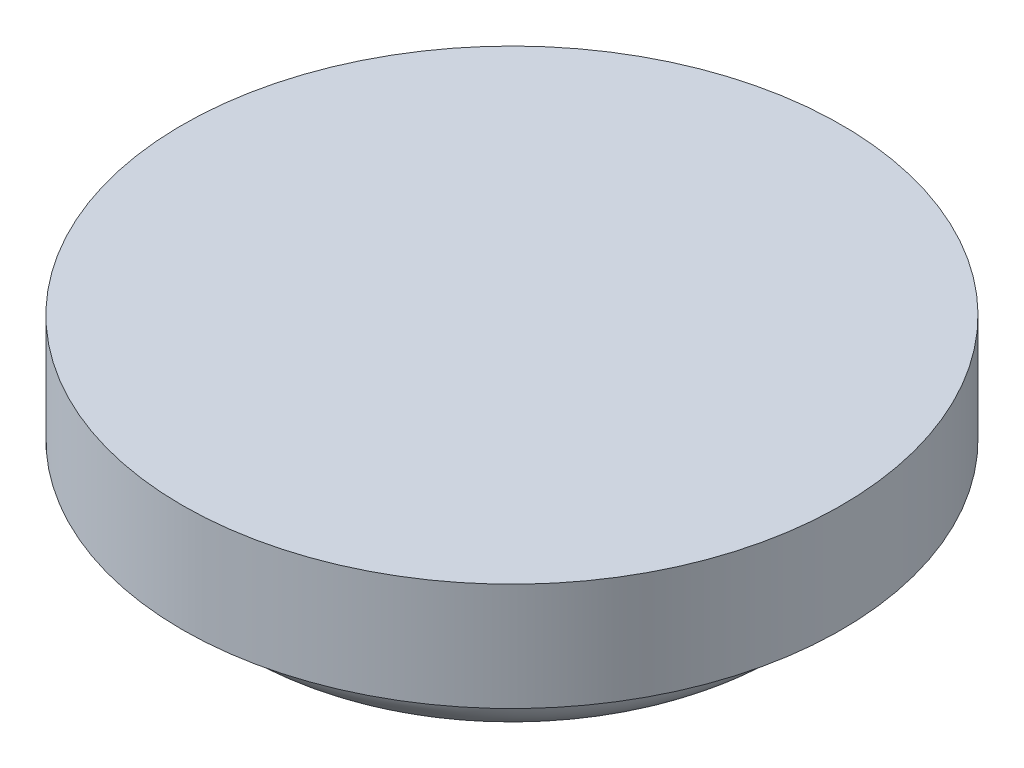
ISO-10303-21;
HEADER;
FILE_DESCRIPTION(('STEP AP214'),'2;1');
FILE_NAME('part.step','',(''),(''),'','','');
FILE_SCHEMA(('AUTOMOTIVE_DESIGN { 1 0 10303 214 1 1 1 1 }'));
ENDSEC;
DATA;
#1=APPLICATION_CONTEXT('core data for automotive mechanical design processes');
#2=APPLICATION_PROTOCOL_DEFINITION('international standard','automotive_design',2000,#1);
#3=PRODUCT_CONTEXT('',#1,'mechanical');
#4=PRODUCT('Part','Part','',(#3));
#5=PRODUCT_RELATED_PRODUCT_CATEGORY('part','',(#4));
#6=PRODUCT_DEFINITION_FORMATION('','',#4);
#7=PRODUCT_DEFINITION_CONTEXT('part definition',#1,'design');
#8=PRODUCT_DEFINITION('design','',#6,#7);
#9=PRODUCT_DEFINITION_SHAPE('','',#8);
#10=(LENGTH_UNIT() NAMED_UNIT(*) SI_UNIT(.MILLI.,.METRE.));
#11=(NAMED_UNIT(*) PLANE_ANGLE_UNIT() SI_UNIT($,.RADIAN.));
#12=(NAMED_UNIT(*) SI_UNIT($,.STERADIAN.) SOLID_ANGLE_UNIT());
#13=UNCERTAINTY_MEASURE_WITH_UNIT(LENGTH_MEASURE(1.E-05),#10,'distance_accuracy_value','');
#14=(GEOMETRIC_REPRESENTATION_CONTEXT(3) GLOBAL_UNCERTAINTY_ASSIGNED_CONTEXT((#13)) GLOBAL_UNIT_ASSIGNED_CONTEXT((#10,
#11,#12)) REPRESENTATION_CONTEXT('',''));
#15=CARTESIAN_POINT('',(0.,0.,0.));
#16=DIRECTION('',(0.,0.,1.));
#17=DIRECTION('',(1.,0.,0.));
#18=AXIS2_PLACEMENT_3D('',#15,#16,#17);
#19=CARTESIAN_POINT('',(0.,1.6,0.));
#20=DIRECTION('',(0.,-1.,0.));
#21=DIRECTION('',(0.,0.,-1.));
#22=AXIS2_PLACEMENT_3D('',#19,#20,#21);
#23=CYLINDRICAL_SURFACE('',#22,6.45);
#24=CARTESIAN_POINT('',(0.,1.,0.));
#25=DIRECTION('',(0.,1.,0.));
#26=DIRECTION('',(0.,0.,1.));
#27=AXIS2_PLACEMENT_3D('',#24,#25,#26);
#28=CIRCLE('',#27,6.45);
#29=CARTESIAN_POINT('',(0.,1.,6.45));
#30=VERTEX_POINT('',#29);
#31=EDGE_CURVE('E40',#30,#30,#28,.T.);
#32=ORIENTED_EDGE('',*,*,#31,.T.);
#33=EDGE_LOOP('',(#32));
#34=FACE_BOUND('',#33,.T.);
#35=CARTESIAN_POINT('',(0.,1.6,0.));
#36=DIRECTION('',(0.,1.,0.));
#37=DIRECTION('',(0.,0.,1.));
#38=AXIS2_PLACEMENT_3D('',#35,#36,#37);
#39=CIRCLE('',#38,6.45);
#40=CARTESIAN_POINT('',(0.,1.6,6.45));
#41=VERTEX_POINT('',#40);
#42=EDGE_CURVE('E44',#41,#41,#39,.T.);
#43=ORIENTED_EDGE('',*,*,#42,.F.);
#44=EDGE_LOOP('',(#43));
#45=FACE_BOUND('',#44,.T.);
#46=ADVANCED_FACE('F33',(#34,#45),#23,.T.);
#47=CARTESIAN_POINT('',(0.,0.,0.));
#48=DIRECTION('',(0.,1.,0.));
#49=DIRECTION('',(0.,0.,1.));
#50=AXIS2_PLACEMENT_3D('',#47,#48,#49);
#51=PLANE('',#50);
#52=CARTESIAN_POINT('',(0.,0.,0.));
#53=DIRECTION('',(0.,1.,0.));
#54=DIRECTION('',(0.,0.,1.));
#55=AXIS2_PLACEMENT_3D('',#52,#53,#54);
#56=CIRCLE('',#55,5.45);
#57=CARTESIAN_POINT('',(0.,0.,5.45));
#58=VERTEX_POINT('',#57);
#59=EDGE_CURVE('E10',#58,#58,#56,.F.);
#60=ORIENTED_EDGE('',*,*,#59,.T.);
#61=EDGE_LOOP('',(#60));
#62=FACE_BOUND('',#61,.T.);
#63=ADVANCED_FACE('F62',(#62),#51,.F.);
#64=CARTESIAN_POINT('',(0.,4.1,0.));
#65=DIRECTION('',(0.,-1.,0.));
#66=DIRECTION('',(0.,0.,-1.));
#67=AXIS2_PLACEMENT_3D('',#64,#65,#66);
#68=CYLINDRICAL_SURFACE('',#67,7.65);
#69=CARTESIAN_POINT('',(0.,4.1,0.));
#70=DIRECTION('',(0.,1.,0.));
#71=DIRECTION('',(0.,0.,1.));
#72=AXIS2_PLACEMENT_3D('',#69,#70,#71);
#73=CIRCLE('',#72,7.65);
#74=CARTESIAN_POINT('',(0.,4.1,7.65));
#75=VERTEX_POINT('',#74);
#76=EDGE_CURVE('E48',#75,#75,#73,.T.);
#77=ORIENTED_EDGE('',*,*,#76,.F.);
#78=EDGE_LOOP('',(#77));
#79=FACE_BOUND('',#78,.T.);
#80=CARTESIAN_POINT('',(0.,1.6,0.));
#81=DIRECTION('',(0.,1.,0.));
#82=DIRECTION('',(0.,0.,1.));
#83=AXIS2_PLACEMENT_3D('',#80,#81,#82);
#84=CIRCLE('',#83,7.65);
#85=CARTESIAN_POINT('',(0.,1.6,7.65));
#86=VERTEX_POINT('',#85);
#87=EDGE_CURVE('E51',#86,#86,#84,.T.);
#88=ORIENTED_EDGE('',*,*,#87,.T.);
#89=EDGE_LOOP('',(#88));
#90=FACE_BOUND('',#89,.T.);
#91=ADVANCED_FACE('F59',(#79,#90),#68,.T.);
#92=CARTESIAN_POINT('',(0.,4.1,0.));
#93=DIRECTION('',(0.,1.,0.));
#94=DIRECTION('',(0.,0.,1.));
#95=AXIS2_PLACEMENT_3D('',#92,#93,#94);
#96=PLANE('',#95);
#97=ORIENTED_EDGE('',*,*,#76,.T.);
#98=EDGE_LOOP('',(#97));
#99=FACE_BOUND('',#98,.T.);
#100=ADVANCED_FACE('F57',(#99),#96,.T.);
#101=CARTESIAN_POINT('',(0.,1.6,0.));
#102=DIRECTION('',(0.,1.,0.));
#103=DIRECTION('',(0.,0.,1.));
#104=AXIS2_PLACEMENT_3D('',#101,#102,#103);
#105=PLANE('',#104);
#106=ORIENTED_EDGE('',*,*,#42,.T.);
#107=EDGE_LOOP('',(#106));
#108=FACE_BOUND('',#107,.T.);
#109=ORIENTED_EDGE('',*,*,#87,.F.);
#110=EDGE_LOOP('',(#109));
#111=FACE_BOUND('',#110,.T.);
#112=ADVANCED_FACE('F66',(#108,#111),#105,.F.);
#113=CARTESIAN_POINT('',(0.,1.,0.));
#114=DIRECTION('',(0.,1.,0.));
#115=DIRECTION('',(0.,0.,1.));
#116=AXIS2_PLACEMENT_3D('',#113,#114,#115);
#117=TOROIDAL_SURFACE('',#116,5.45,1.);
#118=ORIENTED_EDGE('',*,*,#59,.F.);
#119=EDGE_LOOP('',(#118));
#120=FACE_BOUND('',#119,.T.);
#121=ORIENTED_EDGE('',*,*,#31,.F.);
#122=EDGE_LOOP('',(#121));
#123=FACE_BOUND('',#122,.T.);
#124=ADVANCED_FACE('F35',(#120,#123),#117,.T.);
#125=CLOSED_SHELL('',(#46,#63,#91,#100,#112,#124));
#126=MANIFOLD_SOLID_BREP('B2',#125);
#127=ADVANCED_BREP_SHAPE_REPRESENTATION('',(#18,#126),#14);
#128=SHAPE_DEFINITION_REPRESENTATION(#9,#127);
ENDSEC;
END-ISO-10303-21;
